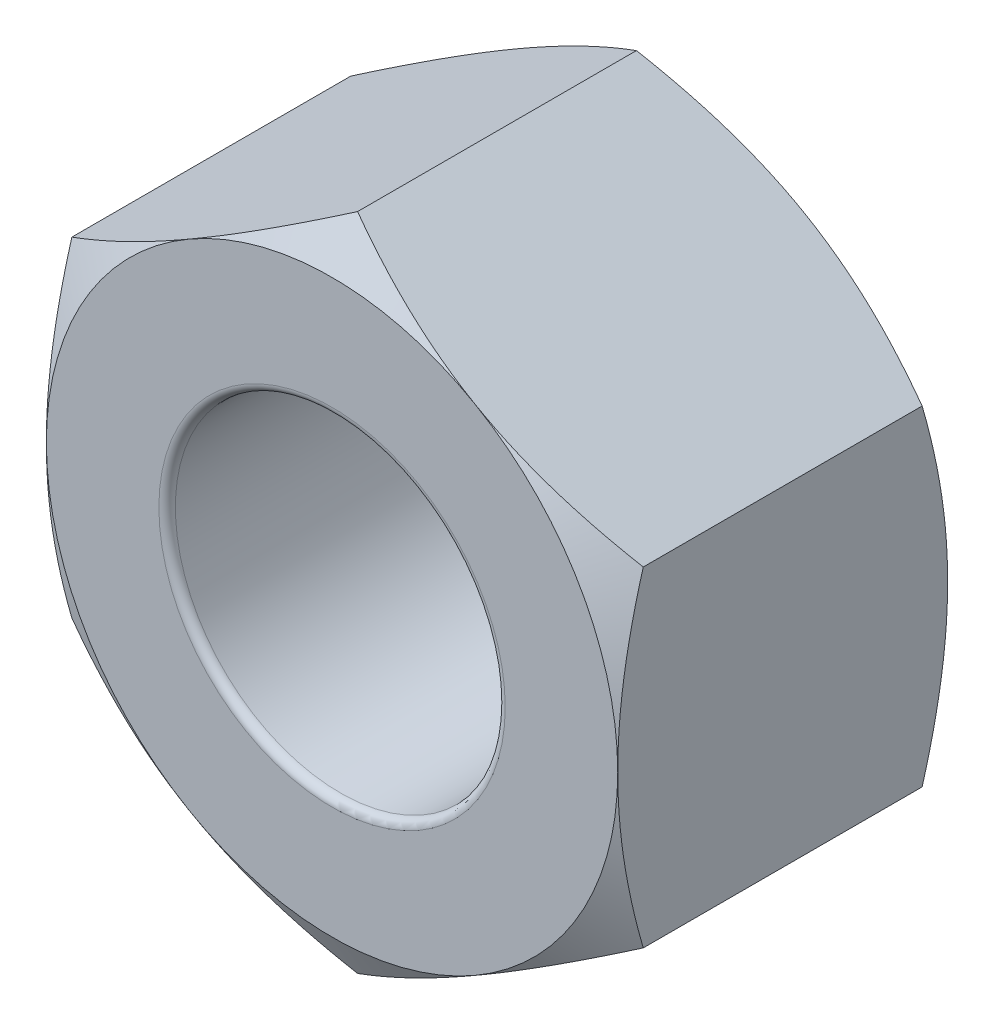
ISO-10303-21;
HEADER;
FILE_DESCRIPTION(('STEP AP214'),'2;1');
FILE_NAME('part.step','',(''),(''),'','','');
FILE_SCHEMA(('AUTOMOTIVE_DESIGN { 1 0 10303 214 1 1 1 1 }'));
ENDSEC;
DATA;
#1=APPLICATION_CONTEXT('core data for automotive mechanical design processes');
#2=APPLICATION_PROTOCOL_DEFINITION('international standard','automotive_design',2000,#1);
#3=PRODUCT_CONTEXT('',#1,'mechanical');
#4=PRODUCT('Part','Part','',(#3));
#5=PRODUCT_RELATED_PRODUCT_CATEGORY('part','',(#4));
#6=PRODUCT_DEFINITION_FORMATION('','',#4);
#7=PRODUCT_DEFINITION_CONTEXT('part definition',#1,'design');
#8=PRODUCT_DEFINITION('design','',#6,#7);
#9=PRODUCT_DEFINITION_SHAPE('','',#8);
#10=(LENGTH_UNIT() NAMED_UNIT(*) SI_UNIT(.MILLI.,.METRE.));
#11=(NAMED_UNIT(*) PLANE_ANGLE_UNIT() SI_UNIT($,.RADIAN.));
#12=(NAMED_UNIT(*) SI_UNIT($,.STERADIAN.) SOLID_ANGLE_UNIT());
#13=UNCERTAINTY_MEASURE_WITH_UNIT(LENGTH_MEASURE(1.E-05),#10,'distance_accuracy_value','');
#14=(GEOMETRIC_REPRESENTATION_CONTEXT(3) GLOBAL_UNCERTAINTY_ASSIGNED_CONTEXT((#13)) GLOBAL_UNIT_ASSIGNED_CONTEXT((#10,
#11,#12)) REPRESENTATION_CONTEXT('',''));
#15=CARTESIAN_POINT('',(0.,0.,0.));
#16=DIRECTION('',(0.,0.,1.));
#17=DIRECTION('',(1.,0.,0.));
#18=AXIS2_PLACEMENT_3D('',#15,#16,#17);
#19=CARTESIAN_POINT('',(1.73205080756888,1.,2.));
#20=DIRECTION('',(-0.5,-0.866025403784439,0.));
#21=DIRECTION('',(0.866025403784439,-0.5,0.));
#22=AXIS2_PLACEMENT_3D('',#19,#20,#21);
#23=PLANE('',#22);
#24=CARTESIAN_POINT('',(-0.000200000000000452,2.00011547005384,0.154767210819086));
#25=CARTESIAN_POINT('',(0.0759165186948391,1.9561695774956,0.129383332818549));
#26=CARTESIAN_POINT('',(0.152690066634804,1.91184434892581,0.106297187993155));
#27=CARTESIAN_POINT('',(0.307566720247552,1.82242627127131,0.0659990961299753));
#28=CARTESIAN_POINT('',(0.385672578921111,1.77733183274084,0.0488014067938086));
#29=CARTESIAN_POINT('',(0.540916268137864,1.68770184698156,0.0220293372969047));
#30=CARTESIAN_POINT('',(0.6180302053965,1.64318009454701,0.0122767979293239));
#31=CARTESIAN_POINT('',(0.772621133871574,1.55392698037765,0.000631938665476812));
#32=CARTESIAN_POINT('',(0.850097562772869,1.50919594329564,-0.00127002168629398));
#33=CARTESIAN_POINT('',(0.994880319540313,1.42560557970194,0.00267579111850206));
#34=CARTESIAN_POINT('',(1.06220826399937,1.38673377284452,0.00755473009185075));
#35=CARTESIAN_POINT('',(1.19642548850006,1.30924342214916,0.0230214979715315));
#36=CARTESIAN_POINT('',(1.26331430392338,1.27062514655873,0.0336146160353383));
#37=CARTESIAN_POINT('',(1.39780850908246,1.19297488100569,0.0600979273322417));
#38=CARTESIAN_POINT('',(1.46539686672829,1.15395272452479,0.0761004403986393));
#39=CARTESIAN_POINT('',(1.59956521690773,1.07649059143196,0.11242036469852));
#40=CARTESIAN_POINT('',(1.66614692982892,1.0380496215538,0.132729235815867));
#41=CARTESIAN_POINT('',(1.73225080756888,0.999884529946163,0.154767210819086));
#42=B_SPLINE_CURVE_WITH_KNOTS('',3,(#24,#25,#26,#27,#28,#29,#30,#31,#32,#33,#34,#35,#36,#37,#38,
#39,#40,#41),.UNSPECIFIED.,.F.,.F.,(4,2,2,2,2,2,2,2,4),(0.,0.274559732725589,0.54977963137929,
0.818187148094556,1.08626496403989,1.31973233850631,1.55341618675482,1.79228517679321,
2.03068481371441),.UNSPECIFIED.);
#43=CARTESIAN_POINT('',(0.,2.,0.15470053837925));
#44=VERTEX_POINT('',#43);
#45=CARTESIAN_POINT('',(0.866025403784439,1.5,0.));
#46=VERTEX_POINT('',#45);
#47=EDGE_CURVE('E60',#44,#46,#42,.T.);
#48=ORIENTED_EDGE('',*,*,#47,.F.);
#49=DIRECTION('',(0.,0.,-1.));
#50=VECTOR('',#49,1.);
#51=CARTESIAN_POINT('',(0.,2.,2.));
#52=LINE('',#51,#50);
#53=CARTESIAN_POINT('',(0.,2.,1.84529946162075));
#54=VERTEX_POINT('',#53);
#55=EDGE_CURVE('E178',#54,#44,#52,.T.);
#56=ORIENTED_EDGE('',*,*,#55,.F.);
#57=CARTESIAN_POINT('',(1.73225080756888,0.999884529946163,1.84523278918091));
#58=CARTESIAN_POINT('',(1.65613428887404,1.04383042250441,1.87061666718145));
#59=CARTESIAN_POINT('',(1.57936074093407,1.08815565107419,1.89370281200685));
#60=CARTESIAN_POINT('',(1.42448408732132,1.1775737287287,1.93400090387002));
#61=CARTESIAN_POINT('',(1.34637822864777,1.22266816725916,1.95119859320619));
#62=CARTESIAN_POINT('',(1.19113453943101,1.31229815301844,1.9779706627031));
#63=CARTESIAN_POINT('',(1.11402060217238,1.35681990545299,1.98772320207068));
#64=CARTESIAN_POINT('',(0.959429673697302,1.44607301962235,1.99936806133452));
#65=CARTESIAN_POINT('',(0.881953244796007,1.49080405670436,2.00127002168629));
#66=CARTESIAN_POINT('',(0.737170488028563,1.57439442029806,1.9973242088815));
#67=CARTESIAN_POINT('',(0.669842543569503,1.61326622715548,1.99244526990815));
#68=CARTESIAN_POINT('',(0.535625319068815,1.69075657785084,1.97697850202847));
#69=CARTESIAN_POINT('',(0.468736503645496,1.72937485344127,1.96638538396466));
#70=CARTESIAN_POINT('',(0.334242298486415,1.80702511899431,1.93990207266776));
#71=CARTESIAN_POINT('',(0.266653940840587,1.84604727547521,1.92389955960136));
#72=CARTESIAN_POINT('',(0.132485590661141,1.92350940856804,1.88757963530148));
#73=CARTESIAN_POINT('',(0.065903877739955,1.9619503784462,1.86727076418413));
#74=CARTESIAN_POINT('',(-0.000200000000000443,2.00011547005384,1.84523278918091));
#75=B_SPLINE_CURVE_WITH_KNOTS('',3,(#57,#58,#59,#60,#61,#62,#63,#64,#65,#66,#67,#68,#69,#70,#71,
#72,#73,#74),.UNSPECIFIED.,.F.,.F.,(4,2,2,2,2,2,2,2,4),(0.,0.27455973272559,0.54977963137929,
0.818187148094555,1.08626496403989,1.31973233850631,1.55341618675482,1.79228517679322,
2.03068481371441),.UNSPECIFIED.);
#76=CARTESIAN_POINT('',(0.866025403784438,1.5,2.));
#77=VERTEX_POINT('',#76);
#78=EDGE_CURVE('E207',#77,#54,#75,.T.);
#79=ORIENTED_EDGE('',*,*,#78,.F.);
#80=CARTESIAN_POINT('',(1.73205080756888,1.,1.84529946162075));
#81=VERTEX_POINT('',#80);
#82=EDGE_CURVE('E169',#81,#77,#75,.T.);
#83=ORIENTED_EDGE('',*,*,#82,.F.);
#84=DIRECTION('',(0.,0.,-1.));
#85=VECTOR('',#84,1.);
#86=CARTESIAN_POINT('',(1.73205080756888,1.,2.));
#87=LINE('',#86,#85);
#88=CARTESIAN_POINT('',(1.73205080756888,1.,0.15470053837925));
#89=VERTEX_POINT('',#88);
#90=EDGE_CURVE('E164',#81,#89,#87,.T.);
#91=ORIENTED_EDGE('',*,*,#90,.T.);
#92=EDGE_CURVE('E157',#46,#89,#42,.T.);
#93=ORIENTED_EDGE('',*,*,#92,.F.);
#94=EDGE_LOOP('',(#48,#56,#79,#83,#91,#93));
#95=FACE_BOUND('',#94,.T.);
#96=ADVANCED_FACE('F45',(#95),#23,.F.);
#97=CARTESIAN_POINT('',(0.,2.,2.));
#98=DIRECTION('',(0.5,-0.866025403784439,0.));
#99=DIRECTION('',(0.866025403784439,0.5,0.));
#100=AXIS2_PLACEMENT_3D('',#97,#98,#99);
#101=PLANE('',#100);
#102=CARTESIAN_POINT('',(-1.73225080756888,0.999884529946163,0.154767210819087));
#103=CARTESIAN_POINT('',(-1.65613428887404,1.04383042250441,0.129383332818549));
#104=CARTESIAN_POINT('',(-1.57936074093407,1.08815565107419,0.106297187993155));
#105=CARTESIAN_POINT('',(-1.42448408732133,1.1775737287287,0.0659990961299756));
#106=CARTESIAN_POINT('',(-1.34637822864777,1.22266816725916,0.0488014067938089));
#107=CARTESIAN_POINT('',(-1.19113453943101,1.31229815301844,0.0220293372969048));
#108=CARTESIAN_POINT('',(-1.11402060217238,1.35681990545299,0.012276797929324));
#109=CARTESIAN_POINT('',(-0.959429673697303,1.44607301962235,0.000631938665476967));
#110=CARTESIAN_POINT('',(-0.881953244796008,1.49080405670436,-0.00127002168629372));
#111=CARTESIAN_POINT('',(-0.737170488028564,1.57439442029806,0.00267579111850242));
#112=CARTESIAN_POINT('',(-0.669842543569503,1.61326622715548,0.00755473009185112));
#113=CARTESIAN_POINT('',(-0.535625319068816,1.69075657785084,0.0230214979715318));
#114=CARTESIAN_POINT('',(-0.468736503645497,1.72937485344127,0.0336146160353385));
#115=CARTESIAN_POINT('',(-0.334242298486415,1.80702511899431,0.0600979273322419));
#116=CARTESIAN_POINT('',(-0.266653940840587,1.84604727547521,0.0761004403986395));
#117=CARTESIAN_POINT('',(-0.132485590661142,1.92350940856804,0.11242036469852));
#118=CARTESIAN_POINT('',(-0.0659038777399559,1.9619503784462,0.132729235815867));
#119=CARTESIAN_POINT('',(0.000199999999999763,2.00011547005384,0.154767210819086));
#120=B_SPLINE_CURVE_WITH_KNOTS('',3,(#102,#103,#104,#105,#106,#107,#108,#109,#110,#111,#112,
#113,#114,#115,#116,#117,#118,#119),.UNSPECIFIED.,.F.,.F.,(4,2,2,2,2,2,2,2,4),(0.,
0.274559732725589,0.54977963137929,0.818187148094556,1.08626496403989,1.31973233850631,
1.55341618675482,1.79228517679322,2.03068481371441),.UNSPECIFIED.);
#121=CARTESIAN_POINT('',(-1.73205080756888,1.,0.154700538379251));
#122=VERTEX_POINT('',#121);
#123=CARTESIAN_POINT('',(-0.866025403784439,1.5,0.));
#124=VERTEX_POINT('',#123);
#125=EDGE_CURVE('E68',#122,#124,#120,.T.);
#126=ORIENTED_EDGE('',*,*,#125,.F.);
#127=DIRECTION('',(0.,0.,-1.));
#128=VECTOR('',#127,1.);
#129=CARTESIAN_POINT('',(-1.73205080756888,1.,2.));
#130=LINE('',#129,#128);
#131=CARTESIAN_POINT('',(-1.73205080756888,1.,1.84529946162075));
#132=VERTEX_POINT('',#131);
#133=EDGE_CURVE('E175',#132,#122,#130,.T.);
#134=ORIENTED_EDGE('',*,*,#133,.F.);
#135=CARTESIAN_POINT('',(0.000199999999999646,2.00011547005384,1.84523278918091));
#136=CARTESIAN_POINT('',(-0.0759165186948399,1.9561695774956,1.87061666718145));
#137=CARTESIAN_POINT('',(-0.152690066634804,1.91184434892581,1.89370281200685));
#138=CARTESIAN_POINT('',(-0.307566720247553,1.82242627127131,1.93400090387002));
#139=CARTESIAN_POINT('',(-0.385672578921111,1.77733183274084,1.95119859320619));
#140=CARTESIAN_POINT('',(-0.540916268137865,1.68770184698156,1.9779706627031));
#141=CARTESIAN_POINT('',(-0.618030205396501,1.64318009454701,1.98772320207068));
#142=CARTESIAN_POINT('',(-0.772621133871575,1.55392698037765,1.99936806133452));
#143=CARTESIAN_POINT('',(-0.85009756277287,1.50919594329564,2.00127002168629));
#144=CARTESIAN_POINT('',(-0.994880319540314,1.42560557970194,1.9973242088815));
#145=CARTESIAN_POINT('',(-1.06220826399937,1.38673377284452,1.99244526990815));
#146=CARTESIAN_POINT('',(-1.19642548850006,1.30924342214916,1.97697850202847));
#147=CARTESIAN_POINT('',(-1.26331430392338,1.27062514655873,1.96638538396466));
#148=CARTESIAN_POINT('',(-1.39780850908246,1.19297488100569,1.93990207266776));
#149=CARTESIAN_POINT('',(-1.46539686672829,1.15395272452479,1.92389955960136));
#150=CARTESIAN_POINT('',(-1.59956521690774,1.07649059143196,1.88757963530148));
#151=CARTESIAN_POINT('',(-1.66614692982892,1.0380496215538,1.86727076418413));
#152=CARTESIAN_POINT('',(-1.73225080756888,0.999884529946163,1.84523278918091));
#153=B_SPLINE_CURVE_WITH_KNOTS('',3,(#135,#136,#137,#138,#139,#140,#141,#142,#143,#144,#145,
#146,#147,#148,#149,#150,#151,#152),.UNSPECIFIED.,.F.,.F.,(4,2,2,2,2,2,2,2,4),(0.,
0.274559732725589,0.54977963137929,0.818187148094555,1.08626496403989,1.31973233850631,
1.55341618675482,1.79228517679322,2.03068481371441),.UNSPECIFIED.);
#154=CARTESIAN_POINT('',(-0.866025403784438,1.5,2.));
#155=VERTEX_POINT('',#154);
#156=EDGE_CURVE('E240',#155,#132,#153,.T.);
#157=ORIENTED_EDGE('',*,*,#156,.F.);
#158=EDGE_CURVE('E373',#54,#155,#153,.T.);
#159=ORIENTED_EDGE('',*,*,#158,.F.);
#160=ORIENTED_EDGE('',*,*,#55,.T.);
#161=EDGE_CURVE('E264',#124,#44,#120,.T.);
#162=ORIENTED_EDGE('',*,*,#161,.F.);
#163=EDGE_LOOP('',(#126,#134,#157,#159,#160,#162));
#164=FACE_BOUND('',#163,.T.);
#165=ADVANCED_FACE('F250',(#164),#101,.F.);
#166=CARTESIAN_POINT('',(-1.73205080756888,1.,2.));
#167=DIRECTION('',(1.,0.,0.));
#168=DIRECTION('',(0.,0.,-1.));
#169=AXIS2_PLACEMENT_3D('',#166,#167,#168);
#170=PLANE('',#169);
#171=CARTESIAN_POINT('',(-1.73205080756888,-3.68531029976215,1.35099354922785));
#172=CARTESIAN_POINT('',(-1.73205080756888,-3.60017670133103,1.30651187050494));
#173=CARTESIAN_POINT('',(-1.73205080756888,-3.51493139513453,1.26224516479091));
#174=CARTESIAN_POINT('',(-1.73205080756888,-3.34416553965027,1.17424033466096));
#175=CARTESIAN_POINT('',(-1.73205080756888,-3.25864498287094,1.13050222478868));
#176=CARTESIAN_POINT('',(-1.73205080756888,-3.00135170355734,1.00010671101384));
#177=CARTESIAN_POINT('',(-1.73205080756888,-2.82909351025738,0.914397459469936));
#178=CARTESIAN_POINT('',(-1.73205080756888,-2.56438560846866,0.786393698546494));
#179=CARTESIAN_POINT('',(-1.73205080756888,-2.47261755899052,0.74269071325412));
#180=CARTESIAN_POINT('',(-1.73205080756888,-2.28842336494669,0.65669701004573));
#181=CARTESIAN_POINT('',(-1.73205080756888,-2.19599724153394,0.61440624698209));
#182=CARTESIAN_POINT('',(-1.73205080756888,-2.01036936831363,0.531677035306993));
#183=CARTESIAN_POINT('',(-1.73205080756888,-1.91716801573327,0.491237699720717));
#184=CARTESIAN_POINT('',(-1.73205080756888,-1.72975428960124,0.41278492994683));
#185=CARTESIAN_POINT('',(-1.73205080756888,-1.63554201028377,0.374771271903829));
#186=CARTESIAN_POINT('',(-1.73205080756888,-1.4350166862079,0.297821875896604));
#187=CARTESIAN_POINT('',(-1.73205080756888,-1.32855154767827,0.259277528276447));
#188=CARTESIAN_POINT('',(-1.73205080756888,-1.11369297336832,0.187799523606475));
#189=CARTESIAN_POINT('',(-1.73205080756888,-1.00529911009401,0.154867127971));
#190=CARTESIAN_POINT('',(-1.73205080756888,-0.788636020327608,0.0974056841639519));
#191=CARTESIAN_POINT('',(-1.73205080756888,-0.680410072563266,0.0727177488388725));
#192=CARTESIAN_POINT('',(-1.73205080756888,-0.462206104570535,0.0332714591766014));
#193=CARTESIAN_POINT('',(-1.73205080756888,-0.352229939115652,0.0185032276808433));
#194=CARTESIAN_POINT('',(-1.73205080756888,-0.129264735583915,0.000723923957081805));
#195=CARTESIAN_POINT('',(-1.73205080756888,-0.0162573024231622,-0.00206814354252884));
#196=CARTESIAN_POINT('',(-1.73205080756888,0.209340210411818,0.00517248444441547));
#197=CARTESIAN_POINT('',(-1.73205080756888,0.32193022402923,0.0152071295912142));
#198=CARTESIAN_POINT('',(-1.73205080756888,0.54789364650811,0.0468780366662559));
#199=CARTESIAN_POINT('',(-1.73205080756888,0.661230794405948,0.0687619890186568));
#200=CARTESIAN_POINT('',(-1.73205080756888,0.885758321824101,0.121609005482036));
#201=CARTESIAN_POINT('',(-1.73205080756888,0.996947486769821,0.152577054760417));
#202=CARTESIAN_POINT('',(-1.73205080756888,1.22354137524686,0.223031032492413));
#203=CARTESIAN_POINT('',(-1.73205080756888,1.33882355200202,0.262902793002673));
#204=CARTESIAN_POINT('',(-1.73205080756888,1.56750623139821,0.347764606365814));
#205=CARTESIAN_POINT('',(-1.73205080756888,1.6809060024789,0.392756598095635));
#206=CARTESIAN_POINT('',(-1.73205080756888,1.90636230655343,0.486392230640956));
#207=CARTESIAN_POINT('',(-1.73205080756888,2.0184167047135,0.53504096348688));
#208=CARTESIAN_POINT('',(-1.73205080756888,2.24137420808821,0.634912696557609));
#209=CARTESIAN_POINT('',(-1.73205080756888,2.35227723247753,0.686135876051319));
#210=CARTESIAN_POINT('',(-1.73205080756888,2.56601099510413,0.78707306158923));
#211=CARTESIAN_POINT('',(-1.73205080756888,2.66889786206476,0.836668742242074));
#212=CARTESIAN_POINT('',(-1.73205080756888,2.8740605656086,0.937117514333061));
#213=CARTESIAN_POINT('',(-1.73205080756888,2.97633637301112,0.98797066523418));
#214=CARTESIAN_POINT('',(-1.73205080756888,3.17995529896029,1.09042473682032));
#215=CARTESIAN_POINT('',(-1.73205080756888,3.28130053906938,1.14202145116551));
#216=CARTESIAN_POINT('',(-1.73205080756888,3.48358493868616,1.24598020170971));
#217=CARTESIAN_POINT('',(-1.73205080756888,3.58452413862987,1.29834215916775));
#218=CARTESIAN_POINT('',(-1.73205080756888,3.68531029976215,1.35099354922785));
#219=B_SPLINE_CURVE_WITH_KNOTS('',3,(#171,#172,#173,#174,#175,#176,#177,#178,#179,#180,#181,
#182,#183,#184,#185,#186,#187,#188,#189,#190,#191,#192,#193,#194,#195,#196,#197,#198,#199,#200,
#201,#202,#203,#204,#205,#206,#207,#208,#209,#210,#211,#212,#213,#214,#215,#216,#217,#218),
.UNSPECIFIED.,.F.,.F.,(4,2,2,2,2,2,2,2,2,2,2,2,2,2,2,2,2,2,2,2,2,2,2,4),(0.,0.288159903265707,
0.576327716912975,1.15349744627572,1.45841816861641,1.76332913353293,2.06809246069223,
2.37282762175177,2.71240009276027,3.05204879004521,3.38471260916491,3.71704469827154,
4.05542881561271,4.39386437345439,4.73966400480699,5.08565376011318,5.45142939181946,
5.81734399550065,6.18377792903885,6.55023741426969,6.89287676738029,7.23553235424771,
7.57669990273929,7.91783258999851),.UNSPECIFIED.);
#220=CARTESIAN_POINT('',(-1.73205080756888,-1.,0.15470053837925));
#221=VERTEX_POINT('',#220);
#222=CARTESIAN_POINT('',(-1.73205080756888,0.,0.));
#223=VERTEX_POINT('',#222);
#224=EDGE_CURVE('E262',#221,#223,#219,.T.);
#225=ORIENTED_EDGE('',*,*,#224,.F.);
#226=DIRECTION('',(0.,0.,-1.));
#227=VECTOR('',#226,1.);
#228=CARTESIAN_POINT('',(-1.73205080756888,-1.,2.));
#229=LINE('',#228,#227);
#230=CARTESIAN_POINT('',(-1.73205080756888,-1.,1.84529946162075));
#231=VERTEX_POINT('',#230);
#232=EDGE_CURVE('E166',#231,#221,#229,.T.);
#233=ORIENTED_EDGE('',*,*,#232,.F.);
#234=CARTESIAN_POINT('',(-1.73205080756888,3.68531029976215,0.649006450772153));
#235=CARTESIAN_POINT('',(-1.73205080756888,3.60017670133103,0.693488129495056));
#236=CARTESIAN_POINT('',(-1.73205080756888,3.51493139513453,0.737754835209087));
#237=CARTESIAN_POINT('',(-1.73205080756888,3.34416553965027,0.825759665339037));
#238=CARTESIAN_POINT('',(-1.73205080756888,3.25864498287094,0.869497775211321));
#239=CARTESIAN_POINT('',(-1.73205080756888,3.00135170355734,0.999893288986156));
#240=CARTESIAN_POINT('',(-1.73205080756888,2.82909351025738,1.08560254053006));
#241=CARTESIAN_POINT('',(-1.73205080756888,2.56438560846866,1.21360630145351));
#242=CARTESIAN_POINT('',(-1.73205080756888,2.47261755899052,1.25730928674588));
#243=CARTESIAN_POINT('',(-1.73205080756888,2.28842336494669,1.34330298995427));
#244=CARTESIAN_POINT('',(-1.73205080756888,2.19599724153394,1.38559375301791));
#245=CARTESIAN_POINT('',(-1.73205080756888,2.01036936831363,1.46832296469301));
#246=CARTESIAN_POINT('',(-1.73205080756888,1.91716801573327,1.50876230027928));
#247=CARTESIAN_POINT('',(-1.73205080756888,1.72975428960124,1.58721507005317));
#248=CARTESIAN_POINT('',(-1.73205080756888,1.63554201028377,1.62522872809617));
#249=CARTESIAN_POINT('',(-1.73205080756888,1.4350166862079,1.7021781241034));
#250=CARTESIAN_POINT('',(-1.73205080756888,1.32855154767827,1.74072247172355));
#251=CARTESIAN_POINT('',(-1.73205080756888,1.11369297336832,1.81220047639353));
#252=CARTESIAN_POINT('',(-1.73205080756888,1.00529911009401,1.845132872029));
#253=CARTESIAN_POINT('',(-1.73205080756888,0.788636020327609,1.90259431583605));
#254=CARTESIAN_POINT('',(-1.73205080756888,0.680410072563266,1.92728225116113));
#255=CARTESIAN_POINT('',(-1.73205080756888,0.462206104570535,1.9667285408234));
#256=CARTESIAN_POINT('',(-1.73205080756888,0.352229939115652,1.98149677231916));
#257=CARTESIAN_POINT('',(-1.73205080756888,0.129264735583914,1.99927607604292));
#258=CARTESIAN_POINT('',(-1.73205080756888,0.0162573024231619,2.00206814354253));
#259=CARTESIAN_POINT('',(-1.73205080756888,-0.209340210411818,1.99482751555558));
#260=CARTESIAN_POINT('',(-1.73205080756888,-0.32193022402923,1.98479287040879));
#261=CARTESIAN_POINT('',(-1.73205080756888,-0.547893646508109,1.95312196333374));
#262=CARTESIAN_POINT('',(-1.73205080756888,-0.661230794405947,1.93123801098134));
#263=CARTESIAN_POINT('',(-1.73205080756888,-0.885758321824101,1.87839099451796));
#264=CARTESIAN_POINT('',(-1.73205080756888,-0.996947486769821,1.84742294523958));
#265=CARTESIAN_POINT('',(-1.73205080756888,-1.22354137524686,1.77696896750759));
#266=CARTESIAN_POINT('',(-1.73205080756888,-1.33882355200201,1.73709720699733));
#267=CARTESIAN_POINT('',(-1.73205080756888,-1.56750623139821,1.65223539363419));
#268=CARTESIAN_POINT('',(-1.73205080756888,-1.6809060024789,1.60724340190436));
#269=CARTESIAN_POINT('',(-1.73205080756888,-1.90636230655343,1.51360776935904));
#270=CARTESIAN_POINT('',(-1.73205080756888,-2.0184167047135,1.46495903651312));
#271=CARTESIAN_POINT('',(-1.73205080756888,-2.24137420808821,1.36508730344239));
#272=CARTESIAN_POINT('',(-1.73205080756888,-2.35227723247753,1.31386412394868));
#273=CARTESIAN_POINT('',(-1.73205080756888,-2.56601099510413,1.21292693841077));
#274=CARTESIAN_POINT('',(-1.73205080756888,-2.66889786206476,1.16333125775793));
#275=CARTESIAN_POINT('',(-1.73205080756888,-2.8740605656086,1.06288248566694));
#276=CARTESIAN_POINT('',(-1.73205080756888,-2.97633637301112,1.01202933476582));
#277=CARTESIAN_POINT('',(-1.73205080756888,-3.17995529896029,0.909575263179685));
#278=CARTESIAN_POINT('',(-1.73205080756888,-3.28130053906938,0.857978548834485));
#279=CARTESIAN_POINT('',(-1.73205080756888,-3.48358493868616,0.754019798290288));
#280=CARTESIAN_POINT('',(-1.73205080756888,-3.58452413862987,0.701657840832251));
#281=CARTESIAN_POINT('',(-1.73205080756888,-3.68531029976215,0.649006450772153));
#282=B_SPLINE_CURVE_WITH_KNOTS('',3,(#234,#235,#236,#237,#238,#239,#240,#241,#242,#243,#244,
#245,#246,#247,#248,#249,#250,#251,#252,#253,#254,#255,#256,#257,#258,#259,#260,#261,#262,#263,
#264,#265,#266,#267,#268,#269,#270,#271,#272,#273,#274,#275,#276,#277,#278,#279,#280,#281),
.UNSPECIFIED.,.F.,.F.,(4,2,2,2,2,2,2,2,2,2,2,2,2,2,2,2,2,2,2,2,2,2,2,4),(0.,0.288159903265706,
0.576327716912975,1.15349744627572,1.45841816861641,1.76332913353293,2.06809246069223,
2.37282762175177,2.71240009276027,3.05204879004521,3.38471260916491,3.71704469827154,
4.05542881561271,4.3938643734544,4.73966400480699,5.08565376011318,5.45142939181946,
5.81734399550065,6.18377792903885,6.5502374142697,6.89287676738029,7.23553235424771,
7.57669990273929,7.91783258999851),.UNSPECIFIED.);
#283=CARTESIAN_POINT('',(-1.73205080756888,0.,2.));
#284=VERTEX_POINT('',#283);
#285=EDGE_CURVE('E232',#284,#231,#282,.T.);
#286=ORIENTED_EDGE('',*,*,#285,.F.);
#287=EDGE_CURVE('E238',#132,#284,#282,.T.);
#288=ORIENTED_EDGE('',*,*,#287,.F.);
#289=ORIENTED_EDGE('',*,*,#133,.T.);
#290=EDGE_CURVE('E256',#223,#122,#219,.T.);
#291=ORIENTED_EDGE('',*,*,#290,.F.);
#292=EDGE_LOOP('',(#225,#233,#286,#288,#289,#291));
#293=FACE_BOUND('',#292,.T.);
#294=ADVANCED_FACE('F246',(#293),#170,.F.);
#295=CARTESIAN_POINT('',(-1.73205080756888,-1.,2.));
#296=DIRECTION('',(0.5,0.866025403784439,0.));
#297=DIRECTION('',(-0.866025403784439,0.5,0.));
#298=AXIS2_PLACEMENT_3D('',#295,#296,#297);
#299=PLANE('',#298);
#300=CARTESIAN_POINT('',(0.000199999999999804,-2.00011547005384,0.154767210819086));
#301=CARTESIAN_POINT('',(-0.0759165186948396,-1.95616957749559,0.129383332818549));
#302=CARTESIAN_POINT('',(-0.152690066634804,-1.91184434892581,0.106297187993155));
#303=CARTESIAN_POINT('',(-0.307566720247552,-1.82242627127131,0.0659990961299752));
#304=CARTESIAN_POINT('',(-0.385672578921111,-1.77733183274084,0.0488014067938086));
#305=CARTESIAN_POINT('',(-0.540916268137865,-1.68770184698156,0.0220293372969046));
#306=CARTESIAN_POINT('',(-0.618030205396501,-1.64318009454701,0.0122767979293239));
#307=CARTESIAN_POINT('',(-0.772621133871575,-1.55392698037765,0.000631938665476843));
#308=CARTESIAN_POINT('',(-0.850097562772869,-1.50919594329564,-0.00127002168629392));
#309=CARTESIAN_POINT('',(-0.994880319540313,-1.42560557970194,0.00267579111850218));
#310=CARTESIAN_POINT('',(-1.06220826399937,-1.38673377284452,0.00755473009185091));
#311=CARTESIAN_POINT('',(-1.19642548850006,-1.30924342214916,0.0230214979715317));
#312=CARTESIAN_POINT('',(-1.26331430392338,-1.27062514655873,0.0336146160353384));
#313=CARTESIAN_POINT('',(-1.39780850908246,-1.19297488100569,0.0600979273322419));
#314=CARTESIAN_POINT('',(-1.46539686672829,-1.15395272452479,0.0761004403986395));
#315=CARTESIAN_POINT('',(-1.59956521690774,-1.07649059143196,0.11242036469852));
#316=CARTESIAN_POINT('',(-1.66614692982892,-1.0380496215538,0.132729235815868));
#317=CARTESIAN_POINT('',(-1.73225080756888,-0.999884529946163,0.154767210819086));
#318=B_SPLINE_CURVE_WITH_KNOTS('',3,(#300,#301,#302,#303,#304,#305,#306,#307,#308,#309,#310,
#311,#312,#313,#314,#315,#316,#317),.UNSPECIFIED.,.F.,.F.,(4,2,2,2,2,2,2,2,4),(0.,
0.27455973272559,0.54977963137929,0.818187148094555,1.08626496403989,1.31973233850631,
1.55341618675482,1.79228517679322,2.03068481371441),.UNSPECIFIED.);
#319=CARTESIAN_POINT('',(0.,-2.,0.15470053837925));
#320=VERTEX_POINT('',#319);
#321=CARTESIAN_POINT('',(-0.866025403784439,-1.5,0.));
#322=VERTEX_POINT('',#321);
#323=EDGE_CURVE('E308',#320,#322,#318,.T.);
#324=ORIENTED_EDGE('',*,*,#323,.F.);
#325=DIRECTION('',(0.,0.,-1.));
#326=VECTOR('',#325,1.);
#327=CARTESIAN_POINT('',(0.,-2.,2.));
#328=LINE('',#327,#326);
#329=CARTESIAN_POINT('',(0.,-2.,1.84529946162075));
#330=VERTEX_POINT('',#329);
#331=EDGE_CURVE('E163',#330,#320,#328,.T.);
#332=ORIENTED_EDGE('',*,*,#331,.F.);
#333=CARTESIAN_POINT('',(-1.73225080756888,-0.999884529946163,1.84523278918091));
#334=CARTESIAN_POINT('',(-1.65613428887404,-1.04383042250441,1.87061666718145));
#335=CARTESIAN_POINT('',(-1.57936074093407,-1.08815565107419,1.89370281200685));
#336=CARTESIAN_POINT('',(-1.42448408732133,-1.17757372872869,1.93400090387002));
#337=CARTESIAN_POINT('',(-1.34637822864777,-1.22266816725916,1.95119859320619));
#338=CARTESIAN_POINT('',(-1.19113453943101,-1.31229815301844,1.9779706627031));
#339=CARTESIAN_POINT('',(-1.11402060217238,-1.35681990545299,1.98772320207068));
#340=CARTESIAN_POINT('',(-0.959429673697303,-1.44607301962235,1.99936806133452));
#341=CARTESIAN_POINT('',(-0.881953244796008,-1.49080405670436,2.00127002168629));
#342=CARTESIAN_POINT('',(-0.737170488028564,-1.57439442029806,1.9973242088815));
#343=CARTESIAN_POINT('',(-0.669842543569503,-1.61326622715548,1.99244526990815));
#344=CARTESIAN_POINT('',(-0.535625319068816,-1.69075657785084,1.97697850202847));
#345=CARTESIAN_POINT('',(-0.468736503645497,-1.72937485344127,1.96638538396466));
#346=CARTESIAN_POINT('',(-0.334242298486415,-1.80702511899431,1.93990207266776));
#347=CARTESIAN_POINT('',(-0.266653940840587,-1.84604727547521,1.92389955960136));
#348=CARTESIAN_POINT('',(-0.132485590661142,-1.92350940856804,1.88757963530148));
#349=CARTESIAN_POINT('',(-0.0659038777399555,-1.9619503784462,1.86727076418413));
#350=CARTESIAN_POINT('',(0.000199999999999817,-2.00011547005384,1.84523278918091));
#351=B_SPLINE_CURVE_WITH_KNOTS('',3,(#333,#334,#335,#336,#337,#338,#339,#340,#341,#342,#343,
#344,#345,#346,#347,#348,#349,#350),.UNSPECIFIED.,.F.,.F.,(4,2,2,2,2,2,2,2,4),(0.,
0.274559732725589,0.54977963137929,0.818187148094555,1.08626496403989,1.31973233850631,
1.55341618675482,1.79228517679322,2.03068481371441),.UNSPECIFIED.);
#352=CARTESIAN_POINT('',(-0.866025403784439,-1.5,2.));
#353=VERTEX_POINT('',#352);
#354=EDGE_CURVE('E225',#353,#330,#351,.T.);
#355=ORIENTED_EDGE('',*,*,#354,.F.);
#356=EDGE_CURVE('E239',#231,#353,#351,.T.);
#357=ORIENTED_EDGE('',*,*,#356,.F.);
#358=ORIENTED_EDGE('',*,*,#232,.T.);
#359=EDGE_CURVE('E263',#322,#221,#318,.T.);
#360=ORIENTED_EDGE('',*,*,#359,.F.);
#361=EDGE_LOOP('',(#324,#332,#355,#357,#358,#360));
#362=FACE_BOUND('',#361,.T.);
#363=ADVANCED_FACE('F249',(#362),#299,.F.);
#364=CARTESIAN_POINT('',(0.,-2.,2.));
#365=DIRECTION('',(-0.5,0.866025403784439,0.));
#366=DIRECTION('',(-0.866025403784439,-0.5,0.));
#367=AXIS2_PLACEMENT_3D('',#364,#365,#366);
#368=PLANE('',#367);
#369=CARTESIAN_POINT('',(1.73225080756888,-0.999884529946163,0.154767210819086));
#370=CARTESIAN_POINT('',(1.65613428887404,-1.04383042250441,0.129383332818549));
#371=CARTESIAN_POINT('',(1.57936074093407,-1.08815565107419,0.106297187993155));
#372=CARTESIAN_POINT('',(1.42448408732132,-1.1775737287287,0.0659990961299753));
#373=CARTESIAN_POINT('',(1.34637822864777,-1.22266816725916,0.0488014067938086));
#374=CARTESIAN_POINT('',(1.19113453943101,-1.31229815301844,0.0220293372969046));
#375=CARTESIAN_POINT('',(1.11402060217238,-1.35681990545299,0.0122767979293237));
#376=CARTESIAN_POINT('',(0.959429673697303,-1.44607301962235,0.000631938665476635));
#377=CARTESIAN_POINT('',(0.881953244796008,-1.49080405670436,-0.00127002168629404));
#378=CARTESIAN_POINT('',(0.737170488028564,-1.57439442029806,0.00267579111850206));
#379=CARTESIAN_POINT('',(0.669842543569503,-1.61326622715548,0.00755473009185073));
#380=CARTESIAN_POINT('',(0.535625319068816,-1.69075657785084,0.0230214979715315));
#381=CARTESIAN_POINT('',(0.468736503645497,-1.72937485344127,0.0336146160353384));
#382=CARTESIAN_POINT('',(0.334242298486415,-1.80702511899431,0.0600979273322418));
#383=CARTESIAN_POINT('',(0.266653940840587,-1.84604727547521,0.0761004403986393));
#384=CARTESIAN_POINT('',(0.132485590661142,-1.92350940856804,0.11242036469852));
#385=CARTESIAN_POINT('',(0.0659038777399552,-1.9619503784462,0.132729235815867));
#386=CARTESIAN_POINT('',(-0.00020000000000045,-2.00011547005384,0.154767210819086));
#387=B_SPLINE_CURVE_WITH_KNOTS('',3,(#369,#370,#371,#372,#373,#374,#375,#376,#377,#378,#379,
#380,#381,#382,#383,#384,#385,#386),.UNSPECIFIED.,.F.,.F.,(4,2,2,2,2,2,2,2,4),(0.,
0.274559732725589,0.54977963137929,0.818187148094555,1.08626496403989,1.31973233850631,
1.55341618675482,1.79228517679322,2.03068481371441),.UNSPECIFIED.);
#388=CARTESIAN_POINT('',(1.73205080756888,-1.,0.15470053837925));
#389=VERTEX_POINT('',#388);
#390=CARTESIAN_POINT('',(0.866025403784439,-1.5,0.));
#391=VERTEX_POINT('',#390);
#392=EDGE_CURVE('E139',#389,#391,#387,.T.);
#393=ORIENTED_EDGE('',*,*,#392,.F.);
#394=DIRECTION('',(0.,0.,-1.));
#395=VECTOR('',#394,1.);
#396=CARTESIAN_POINT('',(1.73205080756888,-1.,2.));
#397=LINE('',#396,#395);
#398=CARTESIAN_POINT('',(1.73205080756888,-1.,1.84529946162075));
#399=VERTEX_POINT('',#398);
#400=EDGE_CURVE('E154',#399,#389,#397,.T.);
#401=ORIENTED_EDGE('',*,*,#400,.F.);
#402=CARTESIAN_POINT('',(-0.000200000000000249,-2.00011547005384,1.84523278918091));
#403=CARTESIAN_POINT('',(0.0759165186948393,-1.9561695774956,1.87061666718145));
#404=CARTESIAN_POINT('',(0.152690066634804,-1.91184434892581,1.89370281200685));
#405=CARTESIAN_POINT('',(0.307566720247552,-1.82242627127131,1.93400090387002));
#406=CARTESIAN_POINT('',(0.385672578921111,-1.77733183274084,1.95119859320619));
#407=CARTESIAN_POINT('',(0.540916268137864,-1.68770184698156,1.9779706627031));
#408=CARTESIAN_POINT('',(0.6180302053965,-1.64318009454701,1.98772320207068));
#409=CARTESIAN_POINT('',(0.772621133871574,-1.55392698037765,1.99936806133452));
#410=CARTESIAN_POINT('',(0.850097562772869,-1.50919594329564,2.00127002168629));
#411=CARTESIAN_POINT('',(0.994880319540313,-1.42560557970194,1.9973242088815));
#412=CARTESIAN_POINT('',(1.06220826399937,-1.38673377284452,1.99244526990815));
#413=CARTESIAN_POINT('',(1.19642548850006,-1.30924342214916,1.97697850202847));
#414=CARTESIAN_POINT('',(1.26331430392338,-1.27062514655873,1.96638538396466));
#415=CARTESIAN_POINT('',(1.39780850908246,-1.19297488100569,1.93990207266776));
#416=CARTESIAN_POINT('',(1.46539686672829,-1.15395272452479,1.92389955960136));
#417=CARTESIAN_POINT('',(1.59956521690774,-1.07649059143196,1.88757963530148));
#418=CARTESIAN_POINT('',(1.66614692982892,-1.0380496215538,1.86727076418413));
#419=CARTESIAN_POINT('',(1.73225080756888,-0.999884529946163,1.84523278918091));
#420=B_SPLINE_CURVE_WITH_KNOTS('',3,(#402,#403,#404,#405,#406,#407,#408,#409,#410,#411,#412,
#413,#414,#415,#416,#417,#418,#419),.UNSPECIFIED.,.F.,.F.,(4,2,2,2,2,2,2,2,4),(0.,
0.274559732725589,0.54977963137929,0.818187148094556,1.08626496403989,1.31973233850631,
1.55341618675482,1.79228517679322,2.03068481371441),.UNSPECIFIED.);
#421=CARTESIAN_POINT('',(0.866025403784439,-1.5,2.));
#422=VERTEX_POINT('',#421);
#423=EDGE_CURVE('E218',#422,#399,#420,.T.);
#424=ORIENTED_EDGE('',*,*,#423,.F.);
#425=EDGE_CURVE('E278',#330,#422,#420,.T.);
#426=ORIENTED_EDGE('',*,*,#425,.F.);
#427=ORIENTED_EDGE('',*,*,#331,.T.);
#428=EDGE_CURVE('E156',#391,#320,#387,.T.);
#429=ORIENTED_EDGE('',*,*,#428,.F.);
#430=EDGE_LOOP('',(#393,#401,#424,#426,#427,#429));
#431=FACE_BOUND('',#430,.T.);
#432=ADVANCED_FACE('F152',(#431),#368,.F.);
#433=CARTESIAN_POINT('',(1.73205080756888,-1.,2.));
#434=DIRECTION('',(-1.,0.,0.));
#435=DIRECTION('',(0.,-1.,0.));
#436=AXIS2_PLACEMENT_3D('',#433,#434,#435);
#437=PLANE('',#436);
#438=CARTESIAN_POINT('',(1.73205080756888,3.68531029976215,1.35099354922785));
#439=CARTESIAN_POINT('',(1.73205080756888,3.60017670133103,1.30651187050494));
#440=CARTESIAN_POINT('',(1.73205080756888,3.51493139513453,1.26224516479091));
#441=CARTESIAN_POINT('',(1.73205080756888,3.34416553965027,1.17424033466096));
#442=CARTESIAN_POINT('',(1.73205080756888,3.25864498287094,1.13050222478868));
#443=CARTESIAN_POINT('',(1.73205080756888,3.00135170355734,1.00010671101384));
#444=CARTESIAN_POINT('',(1.73205080756888,2.82909351025738,0.914397459469936));
#445=CARTESIAN_POINT('',(1.73205080756888,2.56438560846866,0.786393698546494));
#446=CARTESIAN_POINT('',(1.73205080756888,2.47261755899052,0.74269071325412));
#447=CARTESIAN_POINT('',(1.73205080756888,2.28842336494669,0.656697010045731));
#448=CARTESIAN_POINT('',(1.73205080756888,2.19599724153394,0.61440624698209));
#449=CARTESIAN_POINT('',(1.73205080756888,2.01036936831363,0.531677035306993));
#450=CARTESIAN_POINT('',(1.73205080756888,1.91716801573327,0.491237699720717));
#451=CARTESIAN_POINT('',(1.73205080756888,1.72975428960124,0.412784929946829));
#452=CARTESIAN_POINT('',(1.73205080756888,1.63554201028377,0.374771271903829));
#453=CARTESIAN_POINT('',(1.73205080756888,1.4350166862079,0.297821875896604));
#454=CARTESIAN_POINT('',(1.73205080756888,1.32855154767828,0.259277528276447));
#455=CARTESIAN_POINT('',(1.73205080756888,1.11369297336832,0.187799523606475));
#456=CARTESIAN_POINT('',(1.73205080756888,1.00529911009401,0.154867127971));
#457=CARTESIAN_POINT('',(1.73205080756888,0.78863602032761,0.0974056841639519));
#458=CARTESIAN_POINT('',(1.73205080756888,0.680410072563268,0.0727177488388722));
#459=CARTESIAN_POINT('',(1.73205080756888,0.462206104570537,0.033271459176601));
#460=CARTESIAN_POINT('',(1.73205080756888,0.352229939115654,0.018503227680843));
#461=CARTESIAN_POINT('',(1.73205080756888,0.129264735583916,0.000723923957081504));
#462=CARTESIAN_POINT('',(1.73205080756888,0.0162573024231644,-0.00206814354252924));
#463=CARTESIAN_POINT('',(1.73205080756888,-0.209340210411816,0.00517248444441491));
#464=CARTESIAN_POINT('',(1.73205080756888,-0.321930224029227,0.0152071295912136));
#465=CARTESIAN_POINT('',(1.73205080756888,-0.547893646508107,0.0468780366662551));
#466=CARTESIAN_POINT('',(1.73205080756888,-0.661230794405946,0.0687619890186559));
#467=CARTESIAN_POINT('',(1.73205080756888,-0.885758321824099,0.121609005482035));
#468=CARTESIAN_POINT('',(1.73205080756888,-0.996947486769819,0.152577054760416));
#469=CARTESIAN_POINT('',(1.73205080756888,-1.22354137524686,0.223031032492412));
#470=CARTESIAN_POINT('',(1.73205080756888,-1.33882355200201,0.262902793002672));
#471=CARTESIAN_POINT('',(1.73205080756888,-1.56750623139821,0.347764606365813));
#472=CARTESIAN_POINT('',(1.73205080756888,-1.6809060024789,0.392756598095635));
#473=CARTESIAN_POINT('',(1.73205080756888,-1.90636230655343,0.486392230640956));
#474=CARTESIAN_POINT('',(1.73205080756888,-2.0184167047135,0.535040963486879));
#475=CARTESIAN_POINT('',(1.73205080756888,-2.24137420808821,0.634912696557609));
#476=CARTESIAN_POINT('',(1.73205080756888,-2.35227723247753,0.686135876051319));
#477=CARTESIAN_POINT('',(1.73205080756888,-2.56601099510413,0.787073061589231));
#478=CARTESIAN_POINT('',(1.73205080756888,-2.66889786206476,0.836668742242074));
#479=CARTESIAN_POINT('',(1.73205080756888,-2.8740605656086,0.937117514333061));
#480=CARTESIAN_POINT('',(1.73205080756888,-2.97633637301112,0.98797066523418));
#481=CARTESIAN_POINT('',(1.73205080756888,-3.17995529896029,1.09042473682032));
#482=CARTESIAN_POINT('',(1.73205080756888,-3.28130053906938,1.14202145116551));
#483=CARTESIAN_POINT('',(1.73205080756888,-3.48358493868616,1.24598020170971));
#484=CARTESIAN_POINT('',(1.73205080756888,-3.58452413862987,1.29834215916775));
#485=CARTESIAN_POINT('',(1.73205080756888,-3.68531029976215,1.35099354922785));
#486=B_SPLINE_CURVE_WITH_KNOTS('',3,(#438,#439,#440,#441,#442,#443,#444,#445,#446,#447,#448,
#449,#450,#451,#452,#453,#454,#455,#456,#457,#458,#459,#460,#461,#462,#463,#464,#465,#466,#467,
#468,#469,#470,#471,#472,#473,#474,#475,#476,#477,#478,#479,#480,#481,#482,#483,#484,#485),
.UNSPECIFIED.,.F.,.F.,(4,2,2,2,2,2,2,2,2,2,2,2,2,2,2,2,2,2,2,2,2,2,2,4),(0.,0.288159903265706,
0.576327716912975,1.15349744627572,1.45841816861641,1.76332913353293,2.06809246069223,
2.37282762175177,2.71240009276027,3.05204879004521,3.38471260916491,3.71704469827154,
4.05542881561271,4.39386437345439,4.73966400480699,5.08565376011318,5.45142939181946,
5.81734399550065,6.18377792903885,6.5502374142697,6.89287676738029,7.23553235424771,
7.57669990273929,7.91783258999851),.UNSPECIFIED.);
#487=CARTESIAN_POINT('',(1.73205080756888,0.,0.));
#488=VERTEX_POINT('',#487);
#489=EDGE_CURVE('E146',#89,#488,#486,.T.);
#490=ORIENTED_EDGE('',*,*,#489,.F.);
#491=ORIENTED_EDGE('',*,*,#90,.F.);
#492=CARTESIAN_POINT('',(1.73205080756888,-3.68531029976215,0.649006450772153));
#493=CARTESIAN_POINT('',(1.73205080756888,-3.60017670133103,0.693488129495056));
#494=CARTESIAN_POINT('',(1.73205080756888,-3.51493139513453,0.737754835209087));
#495=CARTESIAN_POINT('',(1.73205080756888,-3.34416553965027,0.825759665339037));
#496=CARTESIAN_POINT('',(1.73205080756888,-3.25864498287094,0.869497775211321));
#497=CARTESIAN_POINT('',(1.73205080756888,-3.00135170355734,0.999893288986156));
#498=CARTESIAN_POINT('',(1.73205080756888,-2.82909351025738,1.08560254053006));
#499=CARTESIAN_POINT('',(1.73205080756888,-2.56438560846866,1.21360630145351));
#500=CARTESIAN_POINT('',(1.73205080756888,-2.47261755899052,1.25730928674588));
#501=CARTESIAN_POINT('',(1.73205080756888,-2.28842336494669,1.34330298995427));
#502=CARTESIAN_POINT('',(1.73205080756888,-2.19599724153394,1.38559375301791));
#503=CARTESIAN_POINT('',(1.73205080756888,-2.01036936831363,1.46832296469301));
#504=CARTESIAN_POINT('',(1.73205080756888,-1.91716801573327,1.50876230027928));
#505=CARTESIAN_POINT('',(1.73205080756888,-1.72975428960124,1.58721507005317));
#506=CARTESIAN_POINT('',(1.73205080756888,-1.63554201028377,1.62522872809617));
#507=CARTESIAN_POINT('',(1.73205080756888,-1.4350166862079,1.7021781241034));
#508=CARTESIAN_POINT('',(1.73205080756888,-1.32855154767827,1.74072247172355));
#509=CARTESIAN_POINT('',(1.73205080756888,-1.11369297336832,1.81220047639353));
#510=CARTESIAN_POINT('',(1.73205080756888,-1.00529911009401,1.845132872029));
#511=CARTESIAN_POINT('',(1.73205080756888,-0.788636020327609,1.90259431583605));
#512=CARTESIAN_POINT('',(1.73205080756888,-0.680410072563266,1.92728225116113));
#513=CARTESIAN_POINT('',(1.73205080756888,-0.462206104570536,1.9667285408234));
#514=CARTESIAN_POINT('',(1.73205080756888,-0.352229939115653,1.98149677231916));
#515=CARTESIAN_POINT('',(1.73205080756888,-0.129264735583915,1.99927607604292));
#516=CARTESIAN_POINT('',(1.73205080756888,-0.0162573024231624,2.00206814354253));
#517=CARTESIAN_POINT('',(1.73205080756888,0.209340210411818,1.99482751555559));
#518=CARTESIAN_POINT('',(1.73205080756888,0.321930224029229,1.98479287040879));
#519=CARTESIAN_POINT('',(1.73205080756888,0.547893646508108,1.95312196333375));
#520=CARTESIAN_POINT('',(1.73205080756888,0.661230794405947,1.93123801098134));
#521=CARTESIAN_POINT('',(1.73205080756888,0.8857583218241,1.87839099451796));
#522=CARTESIAN_POINT('',(1.73205080756888,0.99694748676982,1.84742294523958));
#523=CARTESIAN_POINT('',(1.73205080756888,1.22354137524686,1.77696896750759));
#524=CARTESIAN_POINT('',(1.73205080756888,1.33882355200202,1.73709720699733));
#525=CARTESIAN_POINT('',(1.73205080756888,1.56750623139821,1.65223539363419));
#526=CARTESIAN_POINT('',(1.73205080756888,1.6809060024789,1.60724340190436));
#527=CARTESIAN_POINT('',(1.73205080756888,1.90636230655343,1.51360776935904));
#528=CARTESIAN_POINT('',(1.73205080756888,2.0184167047135,1.46495903651312));
#529=CARTESIAN_POINT('',(1.73205080756888,2.24137420808821,1.36508730344239));
#530=CARTESIAN_POINT('',(1.73205080756888,2.35227723247753,1.31386412394868));
#531=CARTESIAN_POINT('',(1.73205080756888,2.56601099510413,1.21292693841077));
#532=CARTESIAN_POINT('',(1.73205080756888,2.66889786206476,1.16333125775793));
#533=CARTESIAN_POINT('',(1.73205080756888,2.8740605656086,1.06288248566694));
#534=CARTESIAN_POINT('',(1.73205080756888,2.97633637301112,1.01202933476582));
#535=CARTESIAN_POINT('',(1.73205080756888,3.17995529896029,0.909575263179685));
#536=CARTESIAN_POINT('',(1.73205080756888,3.28130053906939,0.857978548834485));
#537=CARTESIAN_POINT('',(1.73205080756888,3.48358493868617,0.754019798290288));
#538=CARTESIAN_POINT('',(1.73205080756888,3.58452413862987,0.701657840832251));
#539=CARTESIAN_POINT('',(1.73205080756888,3.68531029976215,0.649006450772153));
#540=B_SPLINE_CURVE_WITH_KNOTS('',3,(#492,#493,#494,#495,#496,#497,#498,#499,#500,#501,#502,
#503,#504,#505,#506,#507,#508,#509,#510,#511,#512,#513,#514,#515,#516,#517,#518,#519,#520,#521,
#522,#523,#524,#525,#526,#527,#528,#529,#530,#531,#532,#533,#534,#535,#536,#537,#538,#539),
.UNSPECIFIED.,.F.,.F.,(4,2,2,2,2,2,2,2,2,2,2,2,2,2,2,2,2,2,2,2,2,2,2,4),(0.,0.288159903265706,
0.576327716912975,1.15349744627572,1.45841816861641,1.76332913353293,2.06809246069223,
2.37282762175177,2.71240009276027,3.05204879004521,3.38471260916491,3.71704469827154,
4.05542881561271,4.39386437345439,4.73966400480699,5.08565376011318,5.45142939181946,
5.81734399550065,6.18377792903885,6.5502374142697,6.89287676738029,7.23553235424771,
7.57669990273929,7.91783258999851),.UNSPECIFIED.);
#541=CARTESIAN_POINT('',(1.73205080756888,0.,2.));
#542=VERTEX_POINT('',#541);
#543=EDGE_CURVE('E181',#542,#81,#540,.T.);
#544=ORIENTED_EDGE('',*,*,#543,.F.);
#545=EDGE_CURVE('E162',#399,#542,#540,.T.);
#546=ORIENTED_EDGE('',*,*,#545,.F.);
#547=ORIENTED_EDGE('',*,*,#400,.T.);
#548=EDGE_CURVE('E136',#488,#389,#486,.T.);
#549=ORIENTED_EDGE('',*,*,#548,.F.);
#550=EDGE_LOOP('',(#490,#491,#544,#546,#547,#549));
#551=FACE_BOUND('',#550,.T.);
#552=ADVANCED_FACE('F160',(#551),#437,.F.);
#553=CARTESIAN_POINT('',(0.,0.,0.));
#554=DIRECTION('',(0.,0.,1.));
#555=DIRECTION('',(1.,0.,0.));
#556=AXIS2_PLACEMENT_3D('',#553,#554,#555);
#557=PLANE('',#556);
#558=CARTESIAN_POINT('',(0.,0.,0.));
#559=DIRECTION('',(0.,0.,1.));
#560=DIRECTION('',(1.,0.,0.));
#561=AXIS2_PLACEMENT_3D('',#558,#559,#560);
#562=CIRCLE('',#561,1.05);
#563=CARTESIAN_POINT('',(1.05,0.,0.));
#564=VERTEX_POINT('',#563);
#565=EDGE_CURVE('E12',#564,#564,#562,.T.);
#566=ORIENTED_EDGE('',*,*,#565,.T.);
#567=EDGE_LOOP('',(#566));
#568=FACE_BOUND('',#567,.T.);
#569=CARTESIAN_POINT('',(0.,0.,0.));
#570=DIRECTION('',(0.,0.,1.));
#571=DIRECTION('',(1.,0.,0.));
#572=AXIS2_PLACEMENT_3D('',#569,#570,#571);
#573=CIRCLE('',#572,1.73205080756888);
#574=EDGE_CURVE('E351',#488,#46,#573,.T.);
#575=ORIENTED_EDGE('',*,*,#574,.F.);
#576=EDGE_CURVE('E141',#391,#488,#573,.T.);
#577=ORIENTED_EDGE('',*,*,#576,.F.);
#578=EDGE_CURVE('E299',#322,#391,#573,.T.);
#579=ORIENTED_EDGE('',*,*,#578,.F.);
#580=EDGE_CURVE('E287',#223,#322,#573,.T.);
#581=ORIENTED_EDGE('',*,*,#580,.F.);
#582=CARTESIAN_POINT('',(0.,0.,0.));
#583=DIRECTION('',(0.,0.,-1.));
#584=DIRECTION('',(-1.,0.,0.));
#585=AXIS2_PLACEMENT_3D('',#582,#583,#584);
#586=CIRCLE('',#585,1.73205080756888);
#587=EDGE_CURVE('E147',#223,#124,#586,.T.);
#588=ORIENTED_EDGE('',*,*,#587,.T.);
#589=EDGE_CURVE('E300',#46,#124,#573,.T.);
#590=ORIENTED_EDGE('',*,*,#589,.F.);
#591=EDGE_LOOP('',(#575,#577,#579,#581,#588,#590));
#592=FACE_BOUND('',#591,.T.);
#593=ADVANCED_FACE('F298',(#568,#592),#557,.F.);
#594=CARTESIAN_POINT('',(0.,0.,2.));
#595=DIRECTION('',(0.,0.,1.));
#596=DIRECTION('',(1.,0.,0.));
#597=AXIS2_PLACEMENT_3D('',#594,#595,#596);
#598=PLANE('',#597);
#599=CARTESIAN_POINT('',(0.,0.,2.));
#600=DIRECTION('',(0.,0.,1.));
#601=DIRECTION('',(1.,0.,0.));
#602=AXIS2_PLACEMENT_3D('',#599,#600,#601);
#603=CIRCLE('',#602,1.05);
#604=CARTESIAN_POINT('',(1.05,0.,2.));
#605=VERTEX_POINT('',#604);
#606=EDGE_CURVE('E53',#605,#605,#603,.F.);
#607=ORIENTED_EDGE('',*,*,#606,.T.);
#608=EDGE_LOOP('',(#607));
#609=FACE_BOUND('',#608,.T.);
#610=CARTESIAN_POINT('',(0.,0.,2.));
#611=DIRECTION('',(0.,0.,1.));
#612=DIRECTION('',(1.,0.,0.));
#613=AXIS2_PLACEMENT_3D('',#610,#611,#612);
#614=CIRCLE('',#613,1.73205080756888);
#615=EDGE_CURVE('E273',#422,#542,#614,.T.);
#616=ORIENTED_EDGE('',*,*,#615,.T.);
#617=EDGE_CURVE('E270',#542,#77,#614,.T.);
#618=ORIENTED_EDGE('',*,*,#617,.T.);
#619=EDGE_CURVE('E272',#77,#155,#614,.T.);
#620=ORIENTED_EDGE('',*,*,#619,.T.);
#621=EDGE_CURVE('E279',#155,#284,#614,.T.);
#622=ORIENTED_EDGE('',*,*,#621,.T.);
#623=EDGE_CURVE('E282',#284,#353,#614,.T.);
#624=ORIENTED_EDGE('',*,*,#623,.T.);
#625=EDGE_CURVE('E280',#353,#422,#614,.T.);
#626=ORIENTED_EDGE('',*,*,#625,.T.);
#627=EDGE_LOOP('',(#616,#618,#620,#622,#624,#626));
#628=FACE_BOUND('',#627,.T.);
#629=ADVANCED_FACE('F359',(#609,#628),#598,.T.);
#630=CARTESIAN_POINT('',(0.,0.,2.));
#631=DIRECTION('',(0.,0.,-1.));
#632=DIRECTION('',(-1.,0.,0.));
#633=AXIS2_PLACEMENT_3D('',#630,#631,#632);
#634=CYLINDRICAL_SURFACE('',#633,1.);
#635=CARTESIAN_POINT('',(0.,0.,1.95));
#636=DIRECTION('',(0.,0.,1.));
#637=DIRECTION('',(1.,0.,0.));
#638=AXIS2_PLACEMENT_3D('',#635,#636,#637);
#639=CIRCLE('',#638,1.);
#640=CARTESIAN_POINT('',(1.,0.,1.95));
#641=VERTEX_POINT('',#640);
#642=EDGE_CURVE('E346',#641,#641,#639,.T.);
#643=ORIENTED_EDGE('',*,*,#642,.T.);
#644=EDGE_LOOP('',(#643));
#645=FACE_BOUND('',#644,.T.);
#646=CARTESIAN_POINT('',(0.,0.,0.0499999999999999));
#647=DIRECTION('',(0.,0.,1.));
#648=DIRECTION('',(1.,0.,0.));
#649=AXIS2_PLACEMENT_3D('',#646,#647,#648);
#650=CIRCLE('',#649,1.);
#651=CARTESIAN_POINT('',(1.,0.,0.0499999999999999));
#652=VERTEX_POINT('',#651);
#653=EDGE_CURVE('E348',#652,#652,#650,.F.);
#654=ORIENTED_EDGE('',*,*,#653,.T.);
#655=EDGE_LOOP('',(#654));
#656=FACE_BOUND('',#655,.T.);
#657=ADVANCED_FACE('F199',(#645,#656),#634,.F.);
#658=CARTESIAN_POINT('',(0.,0.,2.));
#659=DIRECTION('',(0.,0.,-1.));
#660=DIRECTION('',(1.,0.,0.));
#661=AXIS2_PLACEMENT_3D('',#658,#659,#660);
#662=CONICAL_SURFACE('',#661,1.73205080756888,1.0471975511966);
#663=ORIENTED_EDGE('',*,*,#82,.T.);
#664=ORIENTED_EDGE('',*,*,#617,.F.);
#665=ORIENTED_EDGE('',*,*,#543,.T.);
#666=EDGE_LOOP('',(#663,#664,#665));
#667=FACE_BOUND('',#666,.T.);
#668=ADVANCED_FACE('F193',(#667),#662,.T.);
#669=ORIENTED_EDGE('',*,*,#423,.T.);
#670=ORIENTED_EDGE('',*,*,#545,.T.);
#671=ORIENTED_EDGE('',*,*,#615,.F.);
#672=EDGE_LOOP('',(#669,#670,#671));
#673=FACE_BOUND('',#672,.T.);
#674=ADVANCED_FACE('F198',(#673),#662,.T.);
#675=ORIENTED_EDGE('',*,*,#354,.T.);
#676=ORIENTED_EDGE('',*,*,#425,.T.);
#677=ORIENTED_EDGE('',*,*,#625,.F.);
#678=EDGE_LOOP('',(#675,#676,#677));
#679=FACE_BOUND('',#678,.T.);
#680=ADVANCED_FACE('F363',(#679),#662,.T.);
#681=ORIENTED_EDGE('',*,*,#285,.T.);
#682=ORIENTED_EDGE('',*,*,#356,.T.);
#683=ORIENTED_EDGE('',*,*,#623,.F.);
#684=EDGE_LOOP('',(#681,#682,#683));
#685=FACE_BOUND('',#684,.T.);
#686=ADVANCED_FACE('F367',(#685),#662,.T.);
#687=ORIENTED_EDGE('',*,*,#156,.T.);
#688=ORIENTED_EDGE('',*,*,#287,.T.);
#689=ORIENTED_EDGE('',*,*,#621,.F.);
#690=EDGE_LOOP('',(#687,#688,#689));
#691=FACE_BOUND('',#690,.T.);
#692=ADVANCED_FACE('F371',(#691),#662,.T.);
#693=ORIENTED_EDGE('',*,*,#78,.T.);
#694=ORIENTED_EDGE('',*,*,#158,.T.);
#695=ORIENTED_EDGE('',*,*,#619,.F.);
#696=EDGE_LOOP('',(#693,#694,#695));
#697=FACE_BOUND('',#696,.T.);
#698=ADVANCED_FACE('F201',(#697),#662,.T.);
#699=CARTESIAN_POINT('',(0.,0.,0.));
#700=DIRECTION('',(0.,0.,1.));
#701=DIRECTION('',(-1.,0.,0.));
#702=AXIS2_PLACEMENT_3D('',#699,#700,#701);
#703=CONICAL_SURFACE('',#702,1.73205080756888,1.0471975511966);
#704=ORIENTED_EDGE('',*,*,#392,.T.);
#705=ORIENTED_EDGE('',*,*,#576,.T.);
#706=ORIENTED_EDGE('',*,*,#548,.T.);
#707=EDGE_LOOP('',(#704,#705,#706));
#708=FACE_BOUND('',#707,.T.);
#709=ADVANCED_FACE('F138',(#708),#703,.T.);
#710=ORIENTED_EDGE('',*,*,#323,.T.);
#711=ORIENTED_EDGE('',*,*,#578,.T.);
#712=ORIENTED_EDGE('',*,*,#428,.T.);
#713=EDGE_LOOP('',(#710,#711,#712));
#714=FACE_BOUND('',#713,.T.);
#715=ADVANCED_FACE('F340',(#714),#703,.T.);
#716=ORIENTED_EDGE('',*,*,#224,.T.);
#717=ORIENTED_EDGE('',*,*,#580,.T.);
#718=ORIENTED_EDGE('',*,*,#359,.T.);
#719=EDGE_LOOP('',(#716,#717,#718));
#720=FACE_BOUND('',#719,.T.);
#721=ADVANCED_FACE('F202',(#720),#703,.T.);
#722=ORIENTED_EDGE('',*,*,#290,.T.);
#723=ORIENTED_EDGE('',*,*,#125,.T.);
#724=ORIENTED_EDGE('',*,*,#587,.F.);
#725=EDGE_LOOP('',(#722,#723,#724));
#726=FACE_BOUND('',#725,.T.);
#727=ADVANCED_FACE('F293',(#726),#703,.T.);
#728=ORIENTED_EDGE('',*,*,#161,.T.);
#729=ORIENTED_EDGE('',*,*,#47,.T.);
#730=ORIENTED_EDGE('',*,*,#589,.T.);
#731=EDGE_LOOP('',(#728,#729,#730));
#732=FACE_BOUND('',#731,.T.);
#733=ADVANCED_FACE('F338',(#732),#703,.T.);
#734=ORIENTED_EDGE('',*,*,#92,.T.);
#735=ORIENTED_EDGE('',*,*,#489,.T.);
#736=ORIENTED_EDGE('',*,*,#574,.T.);
#737=EDGE_LOOP('',(#734,#735,#736));
#738=FACE_BOUND('',#737,.T.);
#739=ADVANCED_FACE('F330',(#738),#703,.T.);
#740=CARTESIAN_POINT('',(0.,0.,1.95));
#741=DIRECTION('',(0.,0.,1.));
#742=DIRECTION('',(1.,0.,0.));
#743=AXIS2_PLACEMENT_3D('',#740,#741,#742);
#744=TOROIDAL_SURFACE('',#743,1.05,0.05);
#745=ORIENTED_EDGE('',*,*,#606,.F.);
#746=EDGE_LOOP('',(#745));
#747=FACE_BOUND('',#746,.T.);
#748=ORIENTED_EDGE('',*,*,#642,.F.);
#749=EDGE_LOOP('',(#748));
#750=FACE_BOUND('',#749,.T.);
#751=ADVANCED_FACE('F327',(#747,#750),#744,.T.);
#752=CARTESIAN_POINT('',(0.,0.,0.0499999999999999));
#753=DIRECTION('',(0.,0.,1.));
#754=DIRECTION('',(1.,0.,0.));
#755=AXIS2_PLACEMENT_3D('',#752,#753,#754);
#756=TOROIDAL_SURFACE('',#755,1.05,0.05);
#757=ORIENTED_EDGE('',*,*,#653,.F.);
#758=EDGE_LOOP('',(#757));
#759=FACE_BOUND('',#758,.T.);
#760=ORIENTED_EDGE('',*,*,#565,.F.);
#761=EDGE_LOOP('',(#760));
#762=FACE_BOUND('',#761,.T.);
#763=ADVANCED_FACE('F47',(#759,#762),#756,.T.);
#764=CLOSED_SHELL('',(#96,#165,#294,#363,#432,#552,#593,#629,#657,#668,#674,#680,#686,#692,#698,
#709,#715,#721,#727,#733,#739,#751,#763));
#765=MANIFOLD_SOLID_BREP('B2',#764);
#766=ADVANCED_BREP_SHAPE_REPRESENTATION('',(#18,#765),#14);
#767=SHAPE_DEFINITION_REPRESENTATION(#9,#766);
ENDSEC;
END-ISO-10303-21;
